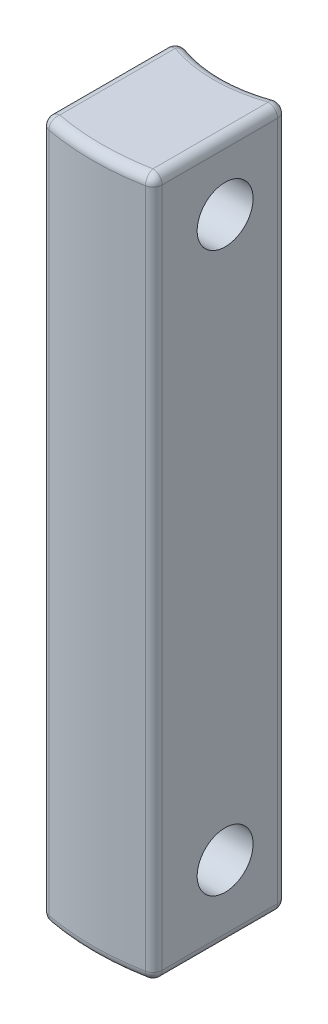
ISO-10303-21;
HEADER;
FILE_DESCRIPTION(('STEP AP214'),'2;1');
FILE_NAME('part.step','',(''),(''),'','','');
FILE_SCHEMA(('AUTOMOTIVE_DESIGN { 1 0 10303 214 1 1 1 1 }'));
ENDSEC;
DATA;
#1=APPLICATION_CONTEXT('core data for automotive mechanical design processes');
#2=APPLICATION_PROTOCOL_DEFINITION('international standard','automotive_design',2000,#1);
#3=PRODUCT_CONTEXT('',#1,'mechanical');
#4=PRODUCT('Part','Part','',(#3));
#5=PRODUCT_RELATED_PRODUCT_CATEGORY('part','',(#4));
#6=PRODUCT_DEFINITION_FORMATION('','',#4);
#7=PRODUCT_DEFINITION_CONTEXT('part definition',#1,'design');
#8=PRODUCT_DEFINITION('design','',#6,#7);
#9=PRODUCT_DEFINITION_SHAPE('','',#8);
#10=(LENGTH_UNIT() NAMED_UNIT(*) SI_UNIT(.MILLI.,.METRE.));
#11=(NAMED_UNIT(*) PLANE_ANGLE_UNIT() SI_UNIT($,.RADIAN.));
#12=(NAMED_UNIT(*) SI_UNIT($,.STERADIAN.) SOLID_ANGLE_UNIT());
#13=UNCERTAINTY_MEASURE_WITH_UNIT(LENGTH_MEASURE(1.E-05),#10,'distance_accuracy_value','');
#14=(GEOMETRIC_REPRESENTATION_CONTEXT(3) GLOBAL_UNCERTAINTY_ASSIGNED_CONTEXT((#13)) GLOBAL_UNIT_ASSIGNED_CONTEXT((#10,
#11,#12)) REPRESENTATION_CONTEXT('',''));
#15=CARTESIAN_POINT('',(0.,0.,0.));
#16=DIRECTION('',(0.,0.,1.));
#17=DIRECTION('',(1.,0.,0.));
#18=AXIS2_PLACEMENT_3D('',#15,#16,#17);
#19=CARTESIAN_POINT('',(0.,37.5,0.698437111909448));
#20=DIRECTION('',(0.,-1.,0.));
#21=DIRECTION('',(0.,0.,-1.));
#22=AXIS2_PLACEMENT_3D('',#19,#20,#21);
#23=CYLINDRICAL_SURFACE('',#22,14.);
#24=DIRECTION('',(0.,-1.,0.));
#25=VECTOR('',#24,1.);
#26=CARTESIAN_POINT('',(4.66666666666667,37.5,13.8977636940583));
#27=LINE('',#26,#25);
#28=CARTESIAN_POINT('',(4.66666666666667,36.5,13.8977636940583));
#29=VERTEX_POINT('',#28);
#30=CARTESIAN_POINT('',(4.66666666666667,-36.5,13.8977636940583));
#31=VERTEX_POINT('',#30);
#32=EDGE_CURVE('E211',#29,#31,#27,.T.);
#33=ORIENTED_EDGE('',*,*,#32,.T.);
#34=CARTESIAN_POINT('',(0.,-36.5,0.698437111909448));
#35=DIRECTION('',(0.,1.,0.));
#36=DIRECTION('',(0.,0.,1.));
#37=AXIS2_PLACEMENT_3D('',#34,#35,#36);
#38=CIRCLE('',#37,14.);
#39=CARTESIAN_POINT('',(-4.66666666666666,-36.5,13.8977636940583));
#40=VERTEX_POINT('',#39);
#41=EDGE_CURVE('E214',#31,#40,#38,.F.);
#42=ORIENTED_EDGE('',*,*,#41,.T.);
#43=DIRECTION('',(0.,-1.,0.));
#44=VECTOR('',#43,1.);
#45=CARTESIAN_POINT('',(-4.66666666666666,37.5,13.8977636940583));
#46=LINE('',#45,#44);
#47=CARTESIAN_POINT('',(-4.66666666666666,36.5,13.8977636940583));
#48=VERTEX_POINT('',#47);
#49=EDGE_CURVE('E208',#40,#48,#46,.F.);
#50=ORIENTED_EDGE('',*,*,#49,.T.);
#51=CARTESIAN_POINT('',(0.,36.5,0.698437111909448));
#52=DIRECTION('',(0.,1.,0.));
#53=DIRECTION('',(0.,0.,1.));
#54=AXIS2_PLACEMENT_3D('',#51,#52,#53);
#55=CIRCLE('',#54,14.);
#56=EDGE_CURVE('E202',#48,#29,#55,.T.);
#57=ORIENTED_EDGE('',*,*,#56,.T.);
#58=EDGE_LOOP('',(#33,#42,#50,#57));
#59=FACE_BOUND('',#58,.T.);
#60=ADVANCED_FACE('F44',(#59),#23,.F.);
#61=CARTESIAN_POINT('',(-6.,37.5,13.347547752583));
#62=DIRECTION('',(1.,0.,0.));
#63=DIRECTION('',(0.,0.,-1.));
#64=AXIS2_PLACEMENT_3D('',#61,#62,#63);
#65=PLANE('',#64);
#66=DIRECTION('',(0.,-1.,0.));
#67=VECTOR('',#66,1.);
#68=CARTESIAN_POINT('',(-6.,37.5,14.8405727356404));
#69=LINE('',#68,#67);
#70=CARTESIAN_POINT('',(-6.,36.5,14.8405727356404));
#71=VERTEX_POINT('',#70);
#72=CARTESIAN_POINT('',(-6.,-36.5,14.8405727356404));
#73=VERTEX_POINT('',#72);
#74=EDGE_CURVE('E174',#71,#73,#69,.T.);
#75=ORIENTED_EDGE('',*,*,#74,.T.);
#76=DIRECTION('',(0.,0.,1.));
#77=VECTOR('',#76,1.);
#78=CARTESIAN_POINT('',(-6.,-36.5,13.347547752583));
#79=LINE('',#78,#77);
#80=CARTESIAN_POINT('',(-6.,-36.5,27.2314354347526));
#81=VERTEX_POINT('',#80);
#82=EDGE_CURVE('E139',#73,#81,#79,.T.);
#83=ORIENTED_EDGE('',*,*,#82,.T.);
#84=DIRECTION('',(0.,-1.,0.));
#85=VECTOR('',#84,1.);
#86=CARTESIAN_POINT('',(-6.,37.5,27.2314354347526));
#87=LINE('',#86,#85);
#88=CARTESIAN_POINT('',(-6.,36.5,27.2314354347526));
#89=VERTEX_POINT('',#88);
#90=EDGE_CURVE('E159',#81,#89,#87,.F.);
#91=ORIENTED_EDGE('',*,*,#90,.T.);
#92=DIRECTION('',(0.,0.,1.));
#93=VECTOR('',#92,1.);
#94=CARTESIAN_POINT('',(-6.,36.5,13.347547752583));
#95=LINE('',#94,#93);
#96=EDGE_CURVE('E170',#89,#71,#95,.F.);
#97=ORIENTED_EDGE('',*,*,#96,.T.);
#98=EDGE_LOOP('',(#75,#83,#91,#97));
#99=FACE_BOUND('',#98,.T.);
#100=CARTESIAN_POINT('',(-6.,30.3678181262423,20.4754985441739));
#101=DIRECTION('',(1.,0.,0.));
#102=DIRECTION('',(0.,0.,-1.));
#103=AXIS2_PLACEMENT_3D('',#100,#101,#102);
#104=CIRCLE('',#103,3.);
#105=CARTESIAN_POINT('',(-6.,30.3678181262423,17.4754985441739));
#106=VERTEX_POINT('',#105);
#107=EDGE_CURVE('E169',#106,#106,#104,.T.);
#108=ORIENTED_EDGE('',*,*,#107,.T.);
#109=EDGE_LOOP('',(#108));
#110=FACE_BOUND('',#109,.T.);
#111=CARTESIAN_POINT('',(-6.,-29.6321818737577,20.4754985441739));
#112=DIRECTION('',(1.,0.,0.));
#113=DIRECTION('',(0.,0.,-1.));
#114=AXIS2_PLACEMENT_3D('',#111,#112,#113);
#115=CIRCLE('',#114,3.);
#116=CARTESIAN_POINT('',(-6.,-29.6321818737577,17.4754985441739));
#117=VERTEX_POINT('',#116);
#118=EDGE_CURVE('E320',#117,#117,#115,.T.);
#119=ORIENTED_EDGE('',*,*,#118,.T.);
#120=EDGE_LOOP('',(#119));
#121=FACE_BOUND('',#120,.T.);
#122=ADVANCED_FACE('F168',(#99,#110,#121),#65,.F.);
#123=CARTESIAN_POINT('',(0.,37.5,0.698437111909447));
#124=DIRECTION('',(0.,-1.,0.));
#125=DIRECTION('',(0.,0.,-1.));
#126=AXIS2_PLACEMENT_3D('',#123,#124,#125);
#127=CYLINDRICAL_SURFACE('',#126,28.);
#128=CARTESIAN_POINT('',(0.,36.5,0.698437111909447));
#129=DIRECTION('',(0.,1.,0.));
#130=DIRECTION('',(0.,0.,1.));
#131=AXIS2_PLACEMENT_3D('',#128,#129,#130);
#132=CIRCLE('',#131,28.);
#133=CARTESIAN_POINT('',(5.18518518518519,36.5,28.2141390763394));
#134=VERTEX_POINT('',#133);
#135=CARTESIAN_POINT('',(-5.18518518518518,36.5,28.2141390763394));
#136=VERTEX_POINT('',#135);
#137=EDGE_CURVE('E54',#134,#136,#132,.F.);
#138=ORIENTED_EDGE('',*,*,#137,.T.);
#139=DIRECTION('',(0.,-1.,0.));
#140=VECTOR('',#139,1.);
#141=CARTESIAN_POINT('',(-5.18518518518518,37.5,28.2141390763394));
#142=LINE('',#141,#140);
#143=CARTESIAN_POINT('',(-5.18518518518518,-36.5,28.2141390763394));
#144=VERTEX_POINT('',#143);
#145=EDGE_CURVE('E11',#136,#144,#142,.T.);
#146=ORIENTED_EDGE('',*,*,#145,.T.);
#147=CARTESIAN_POINT('',(0.,-36.5,0.698437111909447));
#148=DIRECTION('',(0.,1.,0.));
#149=DIRECTION('',(0.,0.,1.));
#150=AXIS2_PLACEMENT_3D('',#147,#148,#149);
#151=CIRCLE('',#150,28.);
#152=CARTESIAN_POINT('',(5.18518518518519,-36.5,28.2141390763394));
#153=VERTEX_POINT('',#152);
#154=EDGE_CURVE('E231',#144,#153,#151,.T.);
#155=ORIENTED_EDGE('',*,*,#154,.T.);
#156=DIRECTION('',(0.,-1.,0.));
#157=VECTOR('',#156,1.);
#158=CARTESIAN_POINT('',(5.18518518518519,37.5,28.2141390763394));
#159=LINE('',#158,#157);
#160=EDGE_CURVE('E66',#153,#134,#159,.F.);
#161=ORIENTED_EDGE('',*,*,#160,.T.);
#162=EDGE_LOOP('',(#138,#146,#155,#161));
#163=FACE_BOUND('',#162,.T.);
#164=ADVANCED_FACE('F361',(#163),#127,.T.);
#165=CARTESIAN_POINT('',(6.,37.5,13.347547752583));
#166=DIRECTION('',(-1.,0.,0.));
#167=DIRECTION('',(0.,0.,1.));
#168=AXIS2_PLACEMENT_3D('',#165,#166,#167);
#169=PLANE('',#168);
#170=DIRECTION('',(0.,-1.,0.));
#171=VECTOR('',#170,1.);
#172=CARTESIAN_POINT('',(6.,37.5,27.2314354347526));
#173=LINE('',#172,#171);
#174=CARTESIAN_POINT('',(6.,36.5,27.2314354347526));
#175=VERTEX_POINT('',#174);
#176=CARTESIAN_POINT('',(6.,-36.5,27.2314354347526));
#177=VERTEX_POINT('',#176);
#178=EDGE_CURVE('E195',#175,#177,#173,.T.);
#179=ORIENTED_EDGE('',*,*,#178,.T.);
#180=DIRECTION('',(0.,0.,-1.));
#181=VECTOR('',#180,1.);
#182=CARTESIAN_POINT('',(6.,-36.5,13.347547752583));
#183=LINE('',#182,#181);
#184=CARTESIAN_POINT('',(6.,-36.5,14.8405727356404));
#185=VERTEX_POINT('',#184);
#186=EDGE_CURVE('E203',#177,#185,#183,.T.);
#187=ORIENTED_EDGE('',*,*,#186,.T.);
#188=DIRECTION('',(0.,-1.,0.));
#189=VECTOR('',#188,1.);
#190=CARTESIAN_POINT('',(6.,37.5,14.8405727356404));
#191=LINE('',#190,#189);
#192=CARTESIAN_POINT('',(6.,36.5,14.8405727356404));
#193=VERTEX_POINT('',#192);
#194=EDGE_CURVE('E196',#185,#193,#191,.F.);
#195=ORIENTED_EDGE('',*,*,#194,.T.);
#196=DIRECTION('',(0.,0.,-1.));
#197=VECTOR('',#196,1.);
#198=CARTESIAN_POINT('',(6.,36.5,28.0480257742641));
#199=LINE('',#198,#197);
#200=EDGE_CURVE('E194',#193,#175,#199,.F.);
#201=ORIENTED_EDGE('',*,*,#200,.T.);
#202=EDGE_LOOP('',(#179,#187,#195,#201));
#203=FACE_BOUND('',#202,.T.);
#204=CARTESIAN_POINT('',(6.,30.3678181262423,20.4754985441739));
#205=DIRECTION('',(1.,0.,0.));
#206=DIRECTION('',(0.,0.,-1.));
#207=AXIS2_PLACEMENT_3D('',#204,#205,#206);
#208=CIRCLE('',#207,3.);
#209=CARTESIAN_POINT('',(6.,30.3678181262423,17.4754985441739));
#210=VERTEX_POINT('',#209);
#211=EDGE_CURVE('E329',#210,#210,#208,.T.);
#212=ORIENTED_EDGE('',*,*,#211,.F.);
#213=EDGE_LOOP('',(#212));
#214=FACE_BOUND('',#213,.T.);
#215=CARTESIAN_POINT('',(6.,-29.6321818737577,20.4754985441739));
#216=DIRECTION('',(1.,0.,0.));
#217=DIRECTION('',(0.,0.,-1.));
#218=AXIS2_PLACEMENT_3D('',#215,#216,#217);
#219=CIRCLE('',#218,3.);
#220=CARTESIAN_POINT('',(6.,-29.6321818737577,17.4754985441739));
#221=VERTEX_POINT('',#220);
#222=EDGE_CURVE('E322',#221,#221,#219,.T.);
#223=ORIENTED_EDGE('',*,*,#222,.F.);
#224=EDGE_LOOP('',(#223));
#225=FACE_BOUND('',#224,.T.);
#226=ADVANCED_FACE('F364',(#203,#214,#225),#169,.F.);
#227=CARTESIAN_POINT('',(0.,37.5,0.698437111909448));
#228=DIRECTION('',(0.,1.,0.));
#229=DIRECTION('',(0.,0.,1.));
#230=AXIS2_PLACEMENT_3D('',#227,#228,#229);
#231=PLANE('',#230);
#232=DIRECTION('',(0.,0.,-1.));
#233=VECTOR('',#232,1.);
#234=CARTESIAN_POINT('',(5.,37.5,13.347547752583));
#235=LINE('',#234,#233);
#236=CARTESIAN_POINT('',(5.,37.5,27.2314354347526));
#237=VERTEX_POINT('',#236);
#238=CARTESIAN_POINT('',(5.,37.5,14.8405727356404));
#239=VERTEX_POINT('',#238);
#240=EDGE_CURVE('E221',#237,#239,#235,.T.);
#241=ORIENTED_EDGE('',*,*,#240,.T.);
#242=CARTESIAN_POINT('',(0.,37.5,0.698437111909448));
#243=DIRECTION('',(0.,1.,0.));
#244=DIRECTION('',(0.,0.,1.));
#245=AXIS2_PLACEMENT_3D('',#242,#243,#244);
#246=CIRCLE('',#245,15.);
#247=CARTESIAN_POINT('',(-5.,37.5,14.8405727356404));
#248=VERTEX_POINT('',#247);
#249=EDGE_CURVE('E229',#239,#248,#246,.F.);
#250=ORIENTED_EDGE('',*,*,#249,.T.);
#251=DIRECTION('',(0.,0.,1.));
#252=VECTOR('',#251,1.);
#253=CARTESIAN_POINT('',(-5.,37.5,28.0480257742641));
#254=LINE('',#253,#252);
#255=CARTESIAN_POINT('',(-5.,37.5,27.2314354347526));
#256=VERTEX_POINT('',#255);
#257=EDGE_CURVE('E222',#248,#256,#254,.T.);
#258=ORIENTED_EDGE('',*,*,#257,.T.);
#259=CARTESIAN_POINT('',(0.,37.5,0.698437111909447));
#260=DIRECTION('',(0.,1.,0.));
#261=DIRECTION('',(0.,0.,1.));
#262=AXIS2_PLACEMENT_3D('',#259,#260,#261);
#263=CIRCLE('',#262,27.);
#264=EDGE_CURVE('E217',#256,#237,#263,.T.);
#265=ORIENTED_EDGE('',*,*,#264,.T.);
#266=EDGE_LOOP('',(#241,#250,#258,#265));
#267=FACE_BOUND('',#266,.T.);
#268=ADVANCED_FACE('F371',(#267),#231,.T.);
#269=CARTESIAN_POINT('',(0.,-37.5,0.698437111909448));
#270=DIRECTION('',(0.,1.,0.));
#271=DIRECTION('',(0.,0.,1.));
#272=AXIS2_PLACEMENT_3D('',#269,#270,#271);
#273=PLANE('',#272);
#274=DIRECTION('',(0.,0.,1.));
#275=VECTOR('',#274,1.);
#276=CARTESIAN_POINT('',(-5.,-37.5,0.698437111909448));
#277=LINE('',#276,#275);
#278=CARTESIAN_POINT('',(-5.,-37.5,27.2314354347526));
#279=VERTEX_POINT('',#278);
#280=CARTESIAN_POINT('',(-5.,-37.5,14.8405727356404));
#281=VERTEX_POINT('',#280);
#282=EDGE_CURVE('E142',#279,#281,#277,.F.);
#283=ORIENTED_EDGE('',*,*,#282,.T.);
#284=CARTESIAN_POINT('',(0.,-37.5,0.698437111909448));
#285=DIRECTION('',(0.,1.,0.));
#286=DIRECTION('',(0.,0.,1.));
#287=AXIS2_PLACEMENT_3D('',#284,#285,#286);
#288=CIRCLE('',#287,15.);
#289=CARTESIAN_POINT('',(5.,-37.5,14.8405727356404));
#290=VERTEX_POINT('',#289);
#291=EDGE_CURVE('E188',#281,#290,#288,.T.);
#292=ORIENTED_EDGE('',*,*,#291,.T.);
#293=DIRECTION('',(0.,0.,-1.));
#294=VECTOR('',#293,1.);
#295=CARTESIAN_POINT('',(5.,-37.5,0.698437111909447));
#296=LINE('',#295,#294);
#297=CARTESIAN_POINT('',(5.,-37.5,27.2314354347526));
#298=VERTEX_POINT('',#297);
#299=EDGE_CURVE('E179',#290,#298,#296,.F.);
#300=ORIENTED_EDGE('',*,*,#299,.T.);
#301=CARTESIAN_POINT('',(0.,-37.5,0.698437111909447));
#302=DIRECTION('',(0.,1.,0.));
#303=DIRECTION('',(0.,0.,1.));
#304=AXIS2_PLACEMENT_3D('',#301,#302,#303);
#305=CIRCLE('',#304,27.);
#306=EDGE_CURVE('E176',#298,#279,#305,.F.);
#307=ORIENTED_EDGE('',*,*,#306,.T.);
#308=EDGE_LOOP('',(#283,#292,#300,#307));
#309=FACE_BOUND('',#308,.T.);
#310=ADVANCED_FACE('F360',(#309),#273,.F.);
#311=CARTESIAN_POINT('',(-6.,-29.6321818737577,20.4754985441739));
#312=DIRECTION('',(1.,0.,0.));
#313=DIRECTION('',(0.,0.,-1.));
#314=AXIS2_PLACEMENT_3D('',#311,#312,#313);
#315=CYLINDRICAL_SURFACE('',#314,3.);
#316=ORIENTED_EDGE('',*,*,#118,.F.);
#317=EDGE_LOOP('',(#316));
#318=FACE_BOUND('',#317,.T.);
#319=ORIENTED_EDGE('',*,*,#222,.T.);
#320=EDGE_LOOP('',(#319));
#321=FACE_BOUND('',#320,.T.);
#322=ADVANCED_FACE('F459',(#318,#321),#315,.F.);
#323=CARTESIAN_POINT('',(-6.,30.3678181262423,20.4754985441739));
#324=DIRECTION('',(1.,0.,0.));
#325=DIRECTION('',(0.,0.,-1.));
#326=AXIS2_PLACEMENT_3D('',#323,#324,#325);
#327=CYLINDRICAL_SURFACE('',#326,3.);
#328=ORIENTED_EDGE('',*,*,#107,.F.);
#329=EDGE_LOOP('',(#328));
#330=FACE_BOUND('',#329,.T.);
#331=ORIENTED_EDGE('',*,*,#211,.T.);
#332=EDGE_LOOP('',(#331));
#333=FACE_BOUND('',#332,.T.);
#334=ADVANCED_FACE('F438',(#330,#333),#327,.F.);
#335=CARTESIAN_POINT('',(5.,36.5,0.698437111909447));
#336=DIRECTION('',(0.,0.,1.));
#337=DIRECTION('',(1.,0.,0.));
#338=AXIS2_PLACEMENT_3D('',#335,#336,#337);
#339=CYLINDRICAL_SURFACE('',#338,1.);
#340=CARTESIAN_POINT('',(5.,36.5,14.8405727356404));
#341=DIRECTION('',(0.,0.,-1.));
#342=DIRECTION('',(-1.,0.,0.));
#343=AXIS2_PLACEMENT_3D('',#340,#341,#342);
#344=CIRCLE('',#343,1.);
#345=EDGE_CURVE('E47',#239,#193,#344,.T.);
#346=ORIENTED_EDGE('',*,*,#345,.F.);
#347=ORIENTED_EDGE('',*,*,#240,.F.);
#348=CARTESIAN_POINT('',(5.,36.5,27.2314354347526));
#349=DIRECTION('',(0.,0.,1.));
#350=DIRECTION('',(1.,0.,0.));
#351=AXIS2_PLACEMENT_3D('',#348,#349,#350);
#352=CIRCLE('',#351,1.);
#353=EDGE_CURVE('E306',#175,#237,#352,.T.);
#354=ORIENTED_EDGE('',*,*,#353,.F.);
#355=ORIENTED_EDGE('',*,*,#200,.F.);
#356=EDGE_LOOP('',(#346,#347,#354,#355));
#357=FACE_BOUND('',#356,.T.);
#358=ADVANCED_FACE('F50',(#357),#339,.T.);
#359=CARTESIAN_POINT('',(5.,36.5,14.8405727356404));
#360=DIRECTION('',(0.,1.,0.));
#361=DIRECTION('',(0.,0.,1.));
#362=AXIS2_PLACEMENT_3D('',#359,#360,#361);
#363=SPHERICAL_SURFACE('',#362,1.);
#364=CARTESIAN_POINT('',(5.,36.5,14.8405727356404));
#365=DIRECTION('',(0.942809041582063,0.,-0.333333333333334));
#366=DIRECTION('',(-0.333333333333334,0.,-0.942809041582063));
#367=AXIS2_PLACEMENT_3D('',#364,#365,#366);
#368=CIRCLE('',#367,1.);
#369=EDGE_CURVE('E301',#239,#29,#368,.F.);
#370=ORIENTED_EDGE('',*,*,#369,.F.);
#371=ORIENTED_EDGE('',*,*,#345,.T.);
#372=CARTESIAN_POINT('',(5.,36.5,14.8405727356404));
#373=DIRECTION('',(0.,1.,0.));
#374=DIRECTION('',(0.,0.,1.));
#375=AXIS2_PLACEMENT_3D('',#372,#373,#374);
#376=CIRCLE('',#375,1.);
#377=EDGE_CURVE('E304',#29,#193,#376,.F.);
#378=ORIENTED_EDGE('',*,*,#377,.F.);
#379=EDGE_LOOP('',(#370,#371,#378));
#380=FACE_BOUND('',#379,.T.);
#381=ADVANCED_FACE('F432',(#380),#363,.T.);
#382=CARTESIAN_POINT('',(5.,36.5,27.2314354347526));
#383=DIRECTION('',(0.,1.,0.));
#384=DIRECTION('',(0.,0.,1.));
#385=AXIS2_PLACEMENT_3D('',#382,#383,#384);
#386=SPHERICAL_SURFACE('',#385,1.);
#387=CARTESIAN_POINT('',(5.,36.5,27.2314354347526));
#388=DIRECTION('',(0.,1.,0.));
#389=DIRECTION('',(0.,0.,1.));
#390=AXIS2_PLACEMENT_3D('',#387,#388,#389);
#391=CIRCLE('',#390,1.);
#392=EDGE_CURVE('E294',#175,#134,#391,.F.);
#393=ORIENTED_EDGE('',*,*,#392,.F.);
#394=ORIENTED_EDGE('',*,*,#353,.T.);
#395=CARTESIAN_POINT('',(5.,36.5,27.2314354347526));
#396=DIRECTION('',(0.982703641586785,0.,-0.185185185185185));
#397=DIRECTION('',(-0.185185185185185,0.,-0.982703641586785));
#398=AXIS2_PLACEMENT_3D('',#395,#396,#397);
#399=CIRCLE('',#398,1.);
#400=EDGE_CURVE('E297',#134,#237,#399,.F.);
#401=ORIENTED_EDGE('',*,*,#400,.F.);
#402=EDGE_LOOP('',(#393,#394,#401));
#403=FACE_BOUND('',#402,.T.);
#404=ADVANCED_FACE('F431',(#403),#386,.T.);
#405=CARTESIAN_POINT('',(5.,37.5,14.8405727356404));
#406=DIRECTION('',(0.,-1.,0.));
#407=DIRECTION('',(0.,0.,-1.));
#408=AXIS2_PLACEMENT_3D('',#405,#406,#407);
#409=CYLINDRICAL_SURFACE('',#408,1.);
#410=ORIENTED_EDGE('',*,*,#377,.T.);
#411=ORIENTED_EDGE('',*,*,#194,.F.);
#412=CARTESIAN_POINT('',(5.,-36.5,14.8405727356404));
#413=DIRECTION('',(0.,-1.,0.));
#414=DIRECTION('',(0.,0.,-1.));
#415=AXIS2_PLACEMENT_3D('',#412,#413,#414);
#416=CIRCLE('',#415,1.);
#417=EDGE_CURVE('E290',#31,#185,#416,.T.);
#418=ORIENTED_EDGE('',*,*,#417,.F.);
#419=ORIENTED_EDGE('',*,*,#32,.F.);
#420=EDGE_LOOP('',(#410,#411,#418,#419));
#421=FACE_BOUND('',#420,.T.);
#422=ADVANCED_FACE('F430',(#421),#409,.T.);
#423=CARTESIAN_POINT('',(0.,36.5,0.698437111909448));
#424=DIRECTION('',(0.,1.,0.));
#425=DIRECTION('',(0.,0.,1.));
#426=AXIS2_PLACEMENT_3D('',#423,#424,#425);
#427=TOROIDAL_SURFACE('',#426,15.,1.);
#428=ORIENTED_EDGE('',*,*,#369,.T.);
#429=ORIENTED_EDGE('',*,*,#56,.F.);
#430=CARTESIAN_POINT('',(-5.,36.5,14.8405727356404));
#431=DIRECTION('',(-0.942809041582063,0.,-0.333333333333334));
#432=DIRECTION('',(-0.333333333333334,0.,0.942809041582063));
#433=AXIS2_PLACEMENT_3D('',#430,#431,#432);
#434=CIRCLE('',#433,1.);
#435=EDGE_CURVE('E284',#248,#48,#434,.T.);
#436=ORIENTED_EDGE('',*,*,#435,.F.);
#437=ORIENTED_EDGE('',*,*,#249,.F.);
#438=EDGE_LOOP('',(#428,#429,#436,#437));
#439=FACE_BOUND('',#438,.T.);
#440=ADVANCED_FACE('F424',(#439),#427,.T.);
#441=CARTESIAN_POINT('',(-5.,36.5,0.698437111909448));
#442=DIRECTION('',(0.,0.,-1.));
#443=DIRECTION('',(-1.,0.,0.));
#444=AXIS2_PLACEMENT_3D('',#441,#442,#443);
#445=CYLINDRICAL_SURFACE('',#444,1.);
#446=CARTESIAN_POINT('',(-5.,36.5,27.2314354347526));
#447=DIRECTION('',(0.,0.,1.));
#448=DIRECTION('',(1.,0.,0.));
#449=AXIS2_PLACEMENT_3D('',#446,#447,#448);
#450=CIRCLE('',#449,1.);
#451=EDGE_CURVE('E274',#256,#89,#450,.T.);
#452=ORIENTED_EDGE('',*,*,#451,.F.);
#453=ORIENTED_EDGE('',*,*,#257,.F.);
#454=CARTESIAN_POINT('',(-5.,36.5,14.8405727356404));
#455=DIRECTION('',(0.,0.,-1.));
#456=DIRECTION('',(-1.,0.,0.));
#457=AXIS2_PLACEMENT_3D('',#454,#455,#456);
#458=CIRCLE('',#457,1.);
#459=EDGE_CURVE('E276',#71,#248,#458,.T.);
#460=ORIENTED_EDGE('',*,*,#459,.F.);
#461=ORIENTED_EDGE('',*,*,#96,.F.);
#462=EDGE_LOOP('',(#452,#453,#460,#461));
#463=FACE_BOUND('',#462,.T.);
#464=ADVANCED_FACE('F340',(#463),#445,.T.);
#465=CARTESIAN_POINT('',(0.,36.5,0.698437111909447));
#466=DIRECTION('',(0.,1.,0.));
#467=DIRECTION('',(0.,0.,1.));
#468=AXIS2_PLACEMENT_3D('',#465,#466,#467);
#469=TOROIDAL_SURFACE('',#468,27.,1.);
#470=ORIENTED_EDGE('',*,*,#400,.T.);
#471=ORIENTED_EDGE('',*,*,#264,.F.);
#472=CARTESIAN_POINT('',(-5.,36.5,27.2314354347526));
#473=DIRECTION('',(-0.982703641586785,0.,-0.185185185185185));
#474=DIRECTION('',(-0.185185185185185,0.,0.982703641586785));
#475=AXIS2_PLACEMENT_3D('',#472,#473,#474);
#476=CIRCLE('',#475,1.);
#477=EDGE_CURVE('E271',#136,#256,#476,.T.);
#478=ORIENTED_EDGE('',*,*,#477,.F.);
#479=ORIENTED_EDGE('',*,*,#137,.F.);
#480=EDGE_LOOP('',(#470,#471,#478,#479));
#481=FACE_BOUND('',#480,.T.);
#482=ADVANCED_FACE('F417',(#481),#469,.T.);
#483=CARTESIAN_POINT('',(5.,37.5,27.2314354347526));
#484=DIRECTION('',(0.,-1.,0.));
#485=DIRECTION('',(0.,0.,-1.));
#486=AXIS2_PLACEMENT_3D('',#483,#484,#485);
#487=CYLINDRICAL_SURFACE('',#486,1.);
#488=ORIENTED_EDGE('',*,*,#392,.T.);
#489=ORIENTED_EDGE('',*,*,#160,.F.);
#490=CARTESIAN_POINT('',(5.,-36.5,27.2314354347526));
#491=DIRECTION('',(0.,-1.,0.));
#492=DIRECTION('',(0.,0.,-1.));
#493=AXIS2_PLACEMENT_3D('',#490,#491,#492);
#494=CIRCLE('',#493,1.);
#495=EDGE_CURVE('E270',#177,#153,#494,.T.);
#496=ORIENTED_EDGE('',*,*,#495,.F.);
#497=ORIENTED_EDGE('',*,*,#178,.F.);
#498=EDGE_LOOP('',(#488,#489,#496,#497));
#499=FACE_BOUND('',#498,.T.);
#500=ADVANCED_FACE('F412',(#499),#487,.T.);
#501=CARTESIAN_POINT('',(5.,-36.5,13.347547752583));
#502=DIRECTION('',(0.,0.,-1.));
#503=DIRECTION('',(-1.,0.,0.));
#504=AXIS2_PLACEMENT_3D('',#501,#502,#503);
#505=CYLINDRICAL_SURFACE('',#504,1.);
#506=CARTESIAN_POINT('',(5.,-36.5,14.8405727356404));
#507=DIRECTION('',(0.,0.,-1.));
#508=DIRECTION('',(-1.,0.,0.));
#509=AXIS2_PLACEMENT_3D('',#506,#507,#508);
#510=CIRCLE('',#509,1.);
#511=EDGE_CURVE('E289',#185,#290,#510,.T.);
#512=ORIENTED_EDGE('',*,*,#511,.F.);
#513=ORIENTED_EDGE('',*,*,#186,.F.);
#514=CARTESIAN_POINT('',(5.,-36.5,27.2314354347526));
#515=DIRECTION('',(0.,0.,1.));
#516=DIRECTION('',(1.,0.,0.));
#517=AXIS2_PLACEMENT_3D('',#514,#515,#516);
#518=CIRCLE('',#517,1.);
#519=EDGE_CURVE('E263',#298,#177,#518,.T.);
#520=ORIENTED_EDGE('',*,*,#519,.F.);
#521=ORIENTED_EDGE('',*,*,#299,.F.);
#522=EDGE_LOOP('',(#512,#513,#520,#521));
#523=FACE_BOUND('',#522,.T.);
#524=ADVANCED_FACE('F408',(#523),#505,.T.);
#525=CARTESIAN_POINT('',(5.,-36.5,14.8405727356404));
#526=DIRECTION('',(0.,-1.,0.));
#527=DIRECTION('',(0.,0.,-1.));
#528=AXIS2_PLACEMENT_3D('',#525,#526,#527);
#529=SPHERICAL_SURFACE('',#528,1.);
#530=ORIENTED_EDGE('',*,*,#417,.T.);
#531=ORIENTED_EDGE('',*,*,#511,.T.);
#532=CARTESIAN_POINT('',(5.,-36.5,14.8405727356404));
#533=DIRECTION('',(0.942809041582064,0.,-0.333333333333332));
#534=DIRECTION('',(-0.333333333333332,0.,-0.942809041582064));
#535=AXIS2_PLACEMENT_3D('',#532,#533,#534);
#536=CIRCLE('',#535,1.);
#537=EDGE_CURVE('E259',#31,#290,#536,.F.);
#538=ORIENTED_EDGE('',*,*,#537,.F.);
#539=EDGE_LOOP('',(#530,#531,#538));
#540=FACE_BOUND('',#539,.T.);
#541=ADVANCED_FACE('F406',(#540),#529,.T.);
#542=CARTESIAN_POINT('',(-5.,36.5,14.8405727356404));
#543=DIRECTION('',(0.,1.,0.));
#544=DIRECTION('',(0.,0.,1.));
#545=AXIS2_PLACEMENT_3D('',#542,#543,#544);
#546=SPHERICAL_SURFACE('',#545,1.);
#547=ORIENTED_EDGE('',*,*,#459,.T.);
#548=ORIENTED_EDGE('',*,*,#435,.T.);
#549=CARTESIAN_POINT('',(-5.,36.5,14.8405727356404));
#550=DIRECTION('',(0.,1.,0.));
#551=DIRECTION('',(0.,0.,1.));
#552=AXIS2_PLACEMENT_3D('',#549,#550,#551);
#553=CIRCLE('',#552,1.);
#554=EDGE_CURVE('E254',#71,#48,#553,.F.);
#555=ORIENTED_EDGE('',*,*,#554,.F.);
#556=EDGE_LOOP('',(#547,#548,#555));
#557=FACE_BOUND('',#556,.T.);
#558=ADVANCED_FACE('F342',(#557),#546,.T.);
#559=CARTESIAN_POINT('',(-5.,36.5,27.2314354347526));
#560=DIRECTION('',(0.,1.,0.));
#561=DIRECTION('',(0.,0.,1.));
#562=AXIS2_PLACEMENT_3D('',#559,#560,#561);
#563=SPHERICAL_SURFACE('',#562,1.);
#564=ORIENTED_EDGE('',*,*,#477,.T.);
#565=ORIENTED_EDGE('',*,*,#451,.T.);
#566=CARTESIAN_POINT('',(-5.,36.5,27.2314354347526));
#567=DIRECTION('',(0.,1.,0.));
#568=DIRECTION('',(0.,0.,1.));
#569=AXIS2_PLACEMENT_3D('',#566,#567,#568);
#570=CIRCLE('',#569,1.);
#571=EDGE_CURVE('E162',#136,#89,#570,.F.);
#572=ORIENTED_EDGE('',*,*,#571,.F.);
#573=EDGE_LOOP('',(#564,#565,#572));
#574=FACE_BOUND('',#573,.T.);
#575=ADVANCED_FACE('F398',(#574),#563,.T.);
#576=CARTESIAN_POINT('',(5.,-36.5,27.2314354347526));
#577=DIRECTION('',(0.,-1.,0.));
#578=DIRECTION('',(0.,0.,-1.));
#579=AXIS2_PLACEMENT_3D('',#576,#577,#578);
#580=SPHERICAL_SURFACE('',#579,1.);
#581=ORIENTED_EDGE('',*,*,#519,.T.);
#582=ORIENTED_EDGE('',*,*,#495,.T.);
#583=CARTESIAN_POINT('',(5.,-36.5,27.2314354347526));
#584=DIRECTION('',(0.982703641586785,0.,-0.185185185185185));
#585=DIRECTION('',(-0.185185185185185,0.,-0.982703641586785));
#586=AXIS2_PLACEMENT_3D('',#583,#584,#585);
#587=CIRCLE('',#586,1.);
#588=EDGE_CURVE('E248',#298,#153,#587,.F.);
#589=ORIENTED_EDGE('',*,*,#588,.F.);
#590=EDGE_LOOP('',(#581,#582,#589));
#591=FACE_BOUND('',#590,.T.);
#592=ADVANCED_FACE('F396',(#591),#580,.T.);
#593=CARTESIAN_POINT('',(0.,-36.5,0.698437111909448));
#594=DIRECTION('',(0.,1.,0.));
#595=DIRECTION('',(0.,0.,1.));
#596=AXIS2_PLACEMENT_3D('',#593,#594,#595);
#597=TOROIDAL_SURFACE('',#596,15.,1.);
#598=ORIENTED_EDGE('',*,*,#537,.T.);
#599=ORIENTED_EDGE('',*,*,#291,.F.);
#600=CARTESIAN_POINT('',(-5.,-36.5,14.8405727356404));
#601=DIRECTION('',(-0.942809041582063,0.,-0.333333333333333));
#602=DIRECTION('',(-0.333333333333333,0.,0.942809041582063));
#603=AXIS2_PLACEMENT_3D('',#600,#601,#602);
#604=CIRCLE('',#603,1.);
#605=EDGE_CURVE('E245',#40,#281,#604,.T.);
#606=ORIENTED_EDGE('',*,*,#605,.F.);
#607=ORIENTED_EDGE('',*,*,#41,.F.);
#608=EDGE_LOOP('',(#598,#599,#606,#607));
#609=FACE_BOUND('',#608,.T.);
#610=ADVANCED_FACE('F354',(#609),#597,.T.);
#611=CARTESIAN_POINT('',(-5.,37.5,14.8405727356404));
#612=DIRECTION('',(0.,-1.,0.));
#613=DIRECTION('',(0.,0.,-1.));
#614=AXIS2_PLACEMENT_3D('',#611,#612,#613);
#615=CYLINDRICAL_SURFACE('',#614,1.);
#616=ORIENTED_EDGE('',*,*,#554,.T.);
#617=ORIENTED_EDGE('',*,*,#49,.F.);
#618=CARTESIAN_POINT('',(-5.,-36.5,14.8405727356404));
#619=DIRECTION('',(0.,-1.,0.));
#620=DIRECTION('',(0.,0.,-1.));
#621=AXIS2_PLACEMENT_3D('',#618,#619,#620);
#622=CIRCLE('',#621,1.);
#623=EDGE_CURVE('E160',#73,#40,#622,.T.);
#624=ORIENTED_EDGE('',*,*,#623,.F.);
#625=ORIENTED_EDGE('',*,*,#74,.F.);
#626=EDGE_LOOP('',(#616,#617,#624,#625));
#627=FACE_BOUND('',#626,.T.);
#628=ADVANCED_FACE('F347',(#627),#615,.T.);
#629=CARTESIAN_POINT('',(-5.,37.5,27.2314354347526));
#630=DIRECTION('',(0.,-1.,0.));
#631=DIRECTION('',(0.,0.,-1.));
#632=AXIS2_PLACEMENT_3D('',#629,#630,#631);
#633=CYLINDRICAL_SURFACE('',#632,1.);
#634=ORIENTED_EDGE('',*,*,#571,.T.);
#635=ORIENTED_EDGE('',*,*,#90,.F.);
#636=CARTESIAN_POINT('',(-5.,-36.5,27.2314354347526));
#637=DIRECTION('',(0.,-1.,0.));
#638=DIRECTION('',(0.,0.,-1.));
#639=AXIS2_PLACEMENT_3D('',#636,#637,#638);
#640=CIRCLE('',#639,1.);
#641=EDGE_CURVE('E146',#144,#81,#640,.T.);
#642=ORIENTED_EDGE('',*,*,#641,.F.);
#643=ORIENTED_EDGE('',*,*,#145,.F.);
#644=EDGE_LOOP('',(#634,#635,#642,#643));
#645=FACE_BOUND('',#644,.T.);
#646=ADVANCED_FACE('F161',(#645),#633,.T.);
#647=CARTESIAN_POINT('',(0.,-36.5,0.698437111909447));
#648=DIRECTION('',(0.,1.,0.));
#649=DIRECTION('',(0.,0.,1.));
#650=AXIS2_PLACEMENT_3D('',#647,#648,#649);
#651=TOROIDAL_SURFACE('',#650,27.,1.);
#652=ORIENTED_EDGE('',*,*,#588,.T.);
#653=ORIENTED_EDGE('',*,*,#154,.F.);
#654=CARTESIAN_POINT('',(-5.,-36.5,27.2314354347526));
#655=DIRECTION('',(-0.982703641586785,0.,-0.185185185185185));
#656=DIRECTION('',(-0.185185185185185,0.,0.982703641586785));
#657=AXIS2_PLACEMENT_3D('',#654,#655,#656);
#658=CIRCLE('',#657,1.);
#659=EDGE_CURVE('E155',#279,#144,#658,.T.);
#660=ORIENTED_EDGE('',*,*,#659,.F.);
#661=ORIENTED_EDGE('',*,*,#306,.F.);
#662=EDGE_LOOP('',(#652,#653,#660,#661));
#663=FACE_BOUND('',#662,.T.);
#664=ADVANCED_FACE('F363',(#663),#651,.T.);
#665=CARTESIAN_POINT('',(-5.,-36.5,14.8405727356404));
#666=DIRECTION('',(0.,-1.,0.));
#667=DIRECTION('',(0.,0.,-1.));
#668=AXIS2_PLACEMENT_3D('',#665,#666,#667);
#669=SPHERICAL_SURFACE('',#668,1.);
#670=ORIENTED_EDGE('',*,*,#623,.T.);
#671=ORIENTED_EDGE('',*,*,#605,.T.);
#672=CARTESIAN_POINT('',(-5.,-36.5,14.8405727356404));
#673=DIRECTION('',(0.,0.,-1.));
#674=DIRECTION('',(-1.,0.,0.));
#675=AXIS2_PLACEMENT_3D('',#672,#673,#674);
#676=CIRCLE('',#675,1.);
#677=EDGE_CURVE('E144',#73,#281,#676,.F.);
#678=ORIENTED_EDGE('',*,*,#677,.F.);
#679=EDGE_LOOP('',(#670,#671,#678));
#680=FACE_BOUND('',#679,.T.);
#681=ADVANCED_FACE('F348',(#680),#669,.T.);
#682=CARTESIAN_POINT('',(-5.,-36.5,27.2314354347526));
#683=DIRECTION('',(0.,-1.,0.));
#684=DIRECTION('',(0.,0.,-1.));
#685=AXIS2_PLACEMENT_3D('',#682,#683,#684);
#686=SPHERICAL_SURFACE('',#685,1.);
#687=ORIENTED_EDGE('',*,*,#659,.T.);
#688=ORIENTED_EDGE('',*,*,#641,.T.);
#689=CARTESIAN_POINT('',(-5.,-36.5,27.2314354347526));
#690=DIRECTION('',(0.,0.,1.));
#691=DIRECTION('',(1.,0.,0.));
#692=AXIS2_PLACEMENT_3D('',#689,#690,#691);
#693=CIRCLE('',#692,1.);
#694=EDGE_CURVE('E136',#279,#81,#693,.F.);
#695=ORIENTED_EDGE('',*,*,#694,.F.);
#696=EDGE_LOOP('',(#687,#688,#695));
#697=FACE_BOUND('',#696,.T.);
#698=ADVANCED_FACE('F147',(#697),#686,.T.);
#699=CARTESIAN_POINT('',(-5.,-36.5,13.347547752583));
#700=DIRECTION('',(0.,0.,1.));
#701=DIRECTION('',(1.,0.,0.));
#702=AXIS2_PLACEMENT_3D('',#699,#700,#701);
#703=CYLINDRICAL_SURFACE('',#702,1.);
#704=ORIENTED_EDGE('',*,*,#677,.T.);
#705=ORIENTED_EDGE('',*,*,#282,.F.);
#706=ORIENTED_EDGE('',*,*,#694,.T.);
#707=ORIENTED_EDGE('',*,*,#82,.F.);
#708=EDGE_LOOP('',(#704,#705,#706,#707));
#709=FACE_BOUND('',#708,.T.);
#710=ADVANCED_FACE('F137',(#709),#703,.T.);
#711=CLOSED_SHELL('',(#60,#122,#164,#226,#268,#310,#322,#334,#358,#381,#404,#422,#440,#464,#482,
#500,#524,#541,#558,#575,#592,#610,#628,#646,#664,#681,#698,#710));
#712=MANIFOLD_SOLID_BREP('B2',#711);
#713=ADVANCED_BREP_SHAPE_REPRESENTATION('',(#18,#712),#14);
#714=SHAPE_DEFINITION_REPRESENTATION(#9,#713);
ENDSEC;
END-ISO-10303-21;
